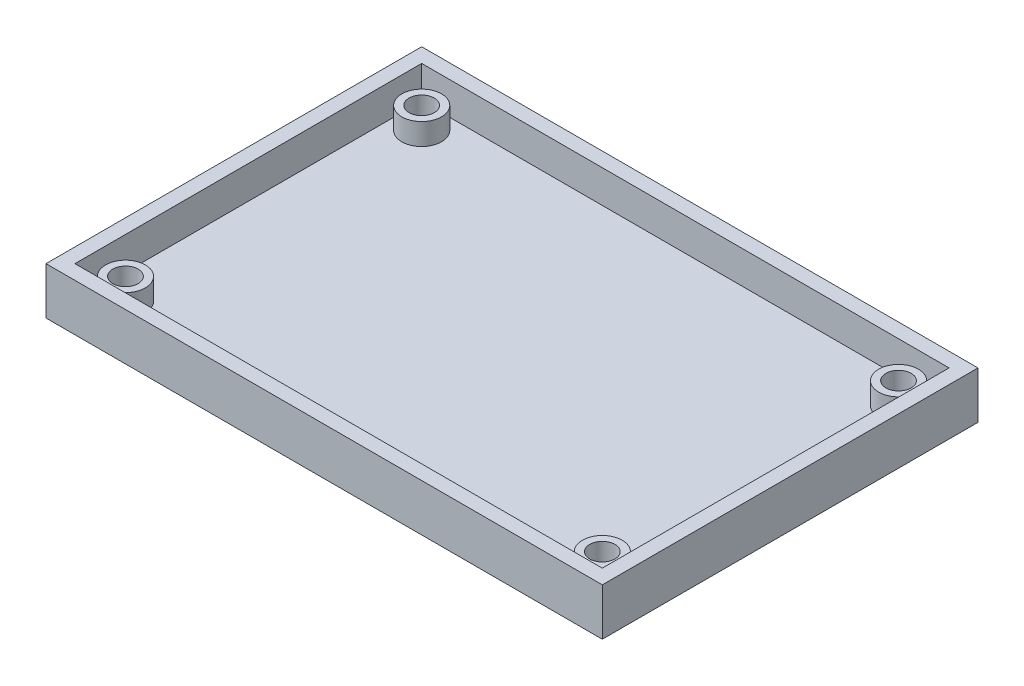
ISO-10303-21;
HEADER;
FILE_DESCRIPTION(('STEP AP214'),'2;1');
FILE_NAME('part.step','',(''),(''),'','','');
FILE_SCHEMA(('AUTOMOTIVE_DESIGN { 1 0 10303 214 1 1 1 1 }'));
ENDSEC;
DATA;
#1=APPLICATION_CONTEXT('core data for automotive mechanical design processes');
#2=APPLICATION_PROTOCOL_DEFINITION('international standard','automotive_design',2000,#1);
#3=PRODUCT_CONTEXT('',#1,'mechanical');
#4=PRODUCT('Part','Part','',(#3));
#5=PRODUCT_RELATED_PRODUCT_CATEGORY('part','',(#4));
#6=PRODUCT_DEFINITION_FORMATION('','',#4);
#7=PRODUCT_DEFINITION_CONTEXT('part definition',#1,'design');
#8=PRODUCT_DEFINITION('design','',#6,#7);
#9=PRODUCT_DEFINITION_SHAPE('','',#8);
#10=(LENGTH_UNIT() NAMED_UNIT(*) SI_UNIT(.MILLI.,.METRE.));
#11=(NAMED_UNIT(*) PLANE_ANGLE_UNIT() SI_UNIT($,.RADIAN.));
#12=(NAMED_UNIT(*) SI_UNIT($,.STERADIAN.) SOLID_ANGLE_UNIT());
#13=UNCERTAINTY_MEASURE_WITH_UNIT(LENGTH_MEASURE(1.E-05),#10,'distance_accuracy_value','');
#14=(GEOMETRIC_REPRESENTATION_CONTEXT(3) GLOBAL_UNCERTAINTY_ASSIGNED_CONTEXT((#13)) GLOBAL_UNIT_ASSIGNED_CONTEXT((#10,
#11,#12)) REPRESENTATION_CONTEXT('',''));
#15=CARTESIAN_POINT('',(0.,0.,0.));
#16=DIRECTION('',(0.,0.,1.));
#17=DIRECTION('',(1.,0.,0.));
#18=AXIS2_PLACEMENT_3D('',#15,#16,#17);
#19=CARTESIAN_POINT('',(0.,0.,0.));
#20=DIRECTION('',(0.,1.,0.));
#21=DIRECTION('',(0.,0.,1.));
#22=AXIS2_PLACEMENT_3D('',#19,#20,#21);
#23=PLANE('',#22);
#24=CARTESIAN_POINT('',(33.,0.,-20.5));
#25=DIRECTION('',(0.,1.,0.));
#26=DIRECTION('',(0.,0.,1.));
#27=AXIS2_PLACEMENT_3D('',#24,#25,#26);
#28=CIRCLE('',#27,2.75);
#29=CARTESIAN_POINT('',(33.,0.,-17.75));
#30=VERTEX_POINT('',#29);
#31=EDGE_CURVE('E276',#30,#30,#28,.T.);
#32=ORIENTED_EDGE('',*,*,#31,.F.);
#33=EDGE_LOOP('',(#32));
#34=FACE_BOUND('',#33,.T.);
#35=CARTESIAN_POINT('',(-33.,0.,20.5));
#36=DIRECTION('',(0.,1.,0.));
#37=DIRECTION('',(0.,0.,1.));
#38=AXIS2_PLACEMENT_3D('',#35,#36,#37);
#39=CIRCLE('',#38,2.75);
#40=CARTESIAN_POINT('',(-33.,0.,23.25));
#41=VERTEX_POINT('',#40);
#42=EDGE_CURVE('E294',#41,#41,#39,.T.);
#43=ORIENTED_EDGE('',*,*,#42,.F.);
#44=EDGE_LOOP('',(#43));
#45=FACE_BOUND('',#44,.T.);
#46=DIRECTION('',(1.,0.,0.));
#47=VECTOR('',#46,1.);
#48=CARTESIAN_POINT('',(-36.5,0.,24.));
#49=LINE('',#48,#47);
#50=CARTESIAN_POINT('',(-36.5,0.,24.));
#51=VERTEX_POINT('',#50);
#52=CARTESIAN_POINT('',(36.5,0.,24.));
#53=VERTEX_POINT('',#52);
#54=EDGE_CURVE('E135',#51,#53,#49,.T.);
#55=ORIENTED_EDGE('',*,*,#54,.T.);
#56=DIRECTION('',(0.,0.,-1.));
#57=VECTOR('',#56,1.);
#58=CARTESIAN_POINT('',(36.5,0.,-24.));
#59=LINE('',#58,#57);
#60=CARTESIAN_POINT('',(36.5,0.,-24.));
#61=VERTEX_POINT('',#60);
#62=EDGE_CURVE('E131',#53,#61,#59,.T.);
#63=ORIENTED_EDGE('',*,*,#62,.T.);
#64=DIRECTION('',(-1.,0.,0.));
#65=VECTOR('',#64,1.);
#66=CARTESIAN_POINT('',(-36.5,0.,-24.));
#67=LINE('',#66,#65);
#68=CARTESIAN_POINT('',(-36.5,0.,-24.));
#69=VERTEX_POINT('',#68);
#70=EDGE_CURVE('E144',#61,#69,#67,.T.);
#71=ORIENTED_EDGE('',*,*,#70,.T.);
#72=DIRECTION('',(0.,0.,1.));
#73=VECTOR('',#72,1.);
#74=CARTESIAN_POINT('',(-36.5,0.,-24.));
#75=LINE('',#74,#73);
#76=EDGE_CURVE('E147',#69,#51,#75,.T.);
#77=ORIENTED_EDGE('',*,*,#76,.T.);
#78=EDGE_LOOP('',(#55,#63,#71,#77));
#79=FACE_BOUND('',#78,.T.);
#80=CARTESIAN_POINT('',(33.,0.,20.5));
#81=DIRECTION('',(0.,1.,0.));
#82=DIRECTION('',(0.,0.,1.));
#83=AXIS2_PLACEMENT_3D('',#80,#81,#82);
#84=CIRCLE('',#83,2.75);
#85=CARTESIAN_POINT('',(33.,0.,23.25));
#86=VERTEX_POINT('',#85);
#87=EDGE_CURVE('E285',#86,#86,#84,.T.);
#88=ORIENTED_EDGE('',*,*,#87,.F.);
#89=EDGE_LOOP('',(#88));
#90=FACE_BOUND('',#89,.T.);
#91=CARTESIAN_POINT('',(-33.,0.,-20.5));
#92=DIRECTION('',(0.,1.,0.));
#93=DIRECTION('',(0.,0.,1.));
#94=AXIS2_PLACEMENT_3D('',#91,#92,#93);
#95=CIRCLE('',#94,2.75000000000001);
#96=CARTESIAN_POINT('',(-33.,0.,-17.75));
#97=VERTEX_POINT('',#96);
#98=EDGE_CURVE('E267',#97,#97,#95,.T.);
#99=ORIENTED_EDGE('',*,*,#98,.F.);
#100=EDGE_LOOP('',(#99));
#101=FACE_BOUND('',#100,.T.);
#102=ADVANCED_FACE('F35',(#34,#45,#79,#90,#101),#23,.T.);
#103=CARTESIAN_POINT('',(0.,4.524,0.));
#104=DIRECTION('',(0.,1.,0.));
#105=DIRECTION('',(0.,0.,1.));
#106=AXIS2_PLACEMENT_3D('',#103,#104,#105);
#107=PLANE('',#106);
#108=DIRECTION('',(0.,0.,-1.));
#109=VECTOR('',#108,1.);
#110=CARTESIAN_POINT('',(38.5,4.524,-26.));
#111=LINE('',#110,#109);
#112=CARTESIAN_POINT('',(38.5,4.524,26.));
#113=VERTEX_POINT('',#112);
#114=CARTESIAN_POINT('',(38.5,4.524,-26.));
#115=VERTEX_POINT('',#114);
#116=EDGE_CURVE('E159',#113,#115,#111,.T.);
#117=ORIENTED_EDGE('',*,*,#116,.T.);
#118=DIRECTION('',(-1.,0.,0.));
#119=VECTOR('',#118,1.);
#120=CARTESIAN_POINT('',(-38.5,4.524,-26.));
#121=LINE('',#120,#119);
#122=CARTESIAN_POINT('',(-38.5,4.524,-26.));
#123=VERTEX_POINT('',#122);
#124=EDGE_CURVE('E161',#115,#123,#121,.T.);
#125=ORIENTED_EDGE('',*,*,#124,.T.);
#126=DIRECTION('',(0.,0.,1.));
#127=VECTOR('',#126,1.);
#128=CARTESIAN_POINT('',(-38.5,4.524,-26.));
#129=LINE('',#128,#127);
#130=CARTESIAN_POINT('',(-38.5,4.524,26.));
#131=VERTEX_POINT('',#130);
#132=EDGE_CURVE('E106',#123,#131,#129,.T.);
#133=ORIENTED_EDGE('',*,*,#132,.T.);
#134=DIRECTION('',(1.,0.,0.));
#135=VECTOR('',#134,1.);
#136=CARTESIAN_POINT('',(-38.5,4.524,26.));
#137=LINE('',#136,#135);
#138=EDGE_CURVE('E58',#131,#113,#137,.T.);
#139=ORIENTED_EDGE('',*,*,#138,.T.);
#140=EDGE_LOOP('',(#117,#125,#133,#139));
#141=FACE_BOUND('',#140,.T.);
#142=DIRECTION('',(-1.,0.,0.));
#143=VECTOR('',#142,1.);
#144=CARTESIAN_POINT('',(-36.5,4.524,-24.));
#145=LINE('',#144,#143);
#146=CARTESIAN_POINT('',(36.5,4.524,-24.));
#147=VERTEX_POINT('',#146);
#148=CARTESIAN_POINT('',(-36.5,4.524,-24.));
#149=VERTEX_POINT('',#148);
#150=EDGE_CURVE('E134',#147,#149,#145,.T.);
#151=ORIENTED_EDGE('',*,*,#150,.F.);
#152=DIRECTION('',(0.,0.,-1.));
#153=VECTOR('',#152,1.);
#154=CARTESIAN_POINT('',(36.5,4.524,-24.));
#155=LINE('',#154,#153);
#156=CARTESIAN_POINT('',(36.5,4.524,24.));
#157=VERTEX_POINT('',#156);
#158=EDGE_CURVE('E132',#157,#147,#155,.T.);
#159=ORIENTED_EDGE('',*,*,#158,.F.);
#160=DIRECTION('',(1.,0.,0.));
#161=VECTOR('',#160,1.);
#162=CARTESIAN_POINT('',(-36.5,4.524,24.));
#163=LINE('',#162,#161);
#164=CARTESIAN_POINT('',(-36.5,4.524,24.));
#165=VERTEX_POINT('',#164);
#166=EDGE_CURVE('E139',#165,#157,#163,.T.);
#167=ORIENTED_EDGE('',*,*,#166,.F.);
#168=DIRECTION('',(0.,0.,1.));
#169=VECTOR('',#168,1.);
#170=CARTESIAN_POINT('',(-36.5,4.524,-24.));
#171=LINE('',#170,#169);
#172=EDGE_CURVE('E137',#149,#165,#171,.T.);
#173=ORIENTED_EDGE('',*,*,#172,.F.);
#174=EDGE_LOOP('',(#151,#159,#167,#173));
#175=FACE_BOUND('',#174,.T.);
#176=ADVANCED_FACE('F171',(#141,#175),#107,.T.);
#177=CARTESIAN_POINT('',(38.5,4.524,-26.));
#178=DIRECTION('',(-1.,0.,0.));
#179=DIRECTION('',(0.,0.,1.));
#180=AXIS2_PLACEMENT_3D('',#177,#178,#179);
#181=PLANE('',#180);
#182=DIRECTION('',(0.,-1.,0.));
#183=VECTOR('',#182,1.);
#184=CARTESIAN_POINT('',(38.5,4.524,26.));
#185=LINE('',#184,#183);
#186=CARTESIAN_POINT('',(38.5,-2.,26.));
#187=VERTEX_POINT('',#186);
#188=EDGE_CURVE('E165',#113,#187,#185,.T.);
#189=ORIENTED_EDGE('',*,*,#188,.T.);
#190=DIRECTION('',(0.,0.,1.));
#191=VECTOR('',#190,1.);
#192=CARTESIAN_POINT('',(38.5,-2.,26.));
#193=LINE('',#192,#191);
#194=CARTESIAN_POINT('',(38.5,-2.,-26.));
#195=VERTEX_POINT('',#194);
#196=EDGE_CURVE('E116',#195,#187,#193,.T.);
#197=ORIENTED_EDGE('',*,*,#196,.F.);
#198=DIRECTION('',(0.,-1.,0.));
#199=VECTOR('',#198,1.);
#200=CARTESIAN_POINT('',(38.5,4.524,-26.));
#201=LINE('',#200,#199);
#202=EDGE_CURVE('E11',#115,#195,#201,.T.);
#203=ORIENTED_EDGE('',*,*,#202,.F.);
#204=ORIENTED_EDGE('',*,*,#116,.F.);
#205=EDGE_LOOP('',(#189,#197,#203,#204));
#206=FACE_BOUND('',#205,.T.);
#207=ADVANCED_FACE('F37',(#206),#181,.F.);
#208=CARTESIAN_POINT('',(-38.5,4.524,-26.));
#209=DIRECTION('',(0.,0.,1.));
#210=DIRECTION('',(1.,0.,0.));
#211=AXIS2_PLACEMENT_3D('',#208,#209,#210);
#212=PLANE('',#211);
#213=ORIENTED_EDGE('',*,*,#202,.T.);
#214=DIRECTION('',(1.,0.,0.));
#215=VECTOR('',#214,1.);
#216=CARTESIAN_POINT('',(38.5,-2.,-26.));
#217=LINE('',#216,#215);
#218=CARTESIAN_POINT('',(-38.5,-2.,-26.));
#219=VERTEX_POINT('',#218);
#220=EDGE_CURVE('E110',#219,#195,#217,.T.);
#221=ORIENTED_EDGE('',*,*,#220,.F.);
#222=DIRECTION('',(0.,-1.,0.));
#223=VECTOR('',#222,1.);
#224=CARTESIAN_POINT('',(-38.5,4.524,-26.));
#225=LINE('',#224,#223);
#226=EDGE_CURVE('E43',#123,#219,#225,.T.);
#227=ORIENTED_EDGE('',*,*,#226,.F.);
#228=ORIENTED_EDGE('',*,*,#124,.F.);
#229=EDGE_LOOP('',(#213,#221,#227,#228));
#230=FACE_BOUND('',#229,.T.);
#231=ADVANCED_FACE('F111',(#230),#212,.F.);
#232=CARTESIAN_POINT('',(-38.5,4.524,-26.));
#233=DIRECTION('',(1.,0.,0.));
#234=DIRECTION('',(0.,0.,-1.));
#235=AXIS2_PLACEMENT_3D('',#232,#233,#234);
#236=PLANE('',#235);
#237=ORIENTED_EDGE('',*,*,#226,.T.);
#238=DIRECTION('',(0.,0.,-1.));
#239=VECTOR('',#238,1.);
#240=CARTESIAN_POINT('',(-38.5,-2.,26.));
#241=LINE('',#240,#239);
#242=CARTESIAN_POINT('',(-38.5,-2.,26.));
#243=VERTEX_POINT('',#242);
#244=EDGE_CURVE('E105',#243,#219,#241,.T.);
#245=ORIENTED_EDGE('',*,*,#244,.F.);
#246=DIRECTION('',(0.,-1.,0.));
#247=VECTOR('',#246,1.);
#248=CARTESIAN_POINT('',(-38.5,4.524,26.));
#249=LINE('',#248,#247);
#250=EDGE_CURVE('E108',#131,#243,#249,.T.);
#251=ORIENTED_EDGE('',*,*,#250,.F.);
#252=ORIENTED_EDGE('',*,*,#132,.F.);
#253=EDGE_LOOP('',(#237,#245,#251,#252));
#254=FACE_BOUND('',#253,.T.);
#255=ADVANCED_FACE('F102',(#254),#236,.F.);
#256=CARTESIAN_POINT('',(-38.5,4.524,26.));
#257=DIRECTION('',(0.,0.,-1.));
#258=DIRECTION('',(-1.,0.,0.));
#259=AXIS2_PLACEMENT_3D('',#256,#257,#258);
#260=PLANE('',#259);
#261=ORIENTED_EDGE('',*,*,#250,.T.);
#262=DIRECTION('',(-1.,0.,0.));
#263=VECTOR('',#262,1.);
#264=CARTESIAN_POINT('',(38.5,-2.,26.));
#265=LINE('',#264,#263);
#266=EDGE_CURVE('E121',#187,#243,#265,.T.);
#267=ORIENTED_EDGE('',*,*,#266,.F.);
#268=ORIENTED_EDGE('',*,*,#188,.F.);
#269=ORIENTED_EDGE('',*,*,#138,.F.);
#270=EDGE_LOOP('',(#261,#267,#268,#269));
#271=FACE_BOUND('',#270,.T.);
#272=ADVANCED_FACE('F168',(#271),#260,.F.);
#273=CARTESIAN_POINT('',(36.5,4.524,-24.));
#274=DIRECTION('',(-1.,0.,0.));
#275=DIRECTION('',(0.,0.,1.));
#276=AXIS2_PLACEMENT_3D('',#273,#274,#275);
#277=PLANE('',#276);
#278=ORIENTED_EDGE('',*,*,#62,.F.);
#279=DIRECTION('',(0.,-1.,0.));
#280=VECTOR('',#279,1.);
#281=CARTESIAN_POINT('',(36.5,4.524,24.));
#282=LINE('',#281,#280);
#283=EDGE_CURVE('E141',#157,#53,#282,.T.);
#284=ORIENTED_EDGE('',*,*,#283,.F.);
#285=ORIENTED_EDGE('',*,*,#158,.T.);
#286=DIRECTION('',(0.,-1.,0.));
#287=VECTOR('',#286,1.);
#288=CARTESIAN_POINT('',(36.5,4.524,-24.));
#289=LINE('',#288,#287);
#290=EDGE_CURVE('E156',#147,#61,#289,.T.);
#291=ORIENTED_EDGE('',*,*,#290,.T.);
#292=EDGE_LOOP('',(#278,#284,#285,#291));
#293=FACE_BOUND('',#292,.T.);
#294=ADVANCED_FACE('F190',(#293),#277,.T.);
#295=CARTESIAN_POINT('',(-36.5,4.524,-24.));
#296=DIRECTION('',(0.,0.,1.));
#297=DIRECTION('',(1.,0.,0.));
#298=AXIS2_PLACEMENT_3D('',#295,#296,#297);
#299=PLANE('',#298);
#300=ORIENTED_EDGE('',*,*,#70,.F.);
#301=ORIENTED_EDGE('',*,*,#290,.F.);
#302=ORIENTED_EDGE('',*,*,#150,.T.);
#303=DIRECTION('',(0.,-1.,0.));
#304=VECTOR('',#303,1.);
#305=CARTESIAN_POINT('',(-36.5,4.524,-24.));
#306=LINE('',#305,#304);
#307=EDGE_CURVE('E154',#149,#69,#306,.T.);
#308=ORIENTED_EDGE('',*,*,#307,.T.);
#309=EDGE_LOOP('',(#300,#301,#302,#308));
#310=FACE_BOUND('',#309,.T.);
#311=ADVANCED_FACE('F182',(#310),#299,.T.);
#312=CARTESIAN_POINT('',(-36.5,4.524,-24.));
#313=DIRECTION('',(1.,0.,0.));
#314=DIRECTION('',(0.,0.,-1.));
#315=AXIS2_PLACEMENT_3D('',#312,#313,#314);
#316=PLANE('',#315);
#317=ORIENTED_EDGE('',*,*,#76,.F.);
#318=ORIENTED_EDGE('',*,*,#307,.F.);
#319=ORIENTED_EDGE('',*,*,#172,.T.);
#320=DIRECTION('',(0.,-1.,0.));
#321=VECTOR('',#320,1.);
#322=CARTESIAN_POINT('',(-36.5,4.524,24.));
#323=LINE('',#322,#321);
#324=EDGE_CURVE('E50',#165,#51,#323,.T.);
#325=ORIENTED_EDGE('',*,*,#324,.T.);
#326=EDGE_LOOP('',(#317,#318,#319,#325));
#327=FACE_BOUND('',#326,.T.);
#328=ADVANCED_FACE('F185',(#327),#316,.T.);
#329=CARTESIAN_POINT('',(-36.5,4.524,24.));
#330=DIRECTION('',(0.,0.,-1.));
#331=DIRECTION('',(-1.,0.,0.));
#332=AXIS2_PLACEMENT_3D('',#329,#330,#331);
#333=PLANE('',#332);
#334=ORIENTED_EDGE('',*,*,#54,.F.);
#335=ORIENTED_EDGE('',*,*,#324,.F.);
#336=ORIENTED_EDGE('',*,*,#166,.T.);
#337=ORIENTED_EDGE('',*,*,#283,.T.);
#338=EDGE_LOOP('',(#334,#335,#336,#337));
#339=FACE_BOUND('',#338,.T.);
#340=ADVANCED_FACE('F192',(#339),#333,.T.);
#341=CARTESIAN_POINT('',(0.,-2.,0.));
#342=DIRECTION('',(0.,1.,0.));
#343=DIRECTION('',(0.,0.,1.));
#344=AXIS2_PLACEMENT_3D('',#341,#342,#343);
#345=PLANE('',#344);
#346=CARTESIAN_POINT('',(33.,-2.,-20.5));
#347=DIRECTION('',(0.,1.,0.));
#348=DIRECTION('',(0.,0.,1.));
#349=AXIS2_PLACEMENT_3D('',#346,#347,#348);
#350=CIRCLE('',#349,1.75);
#351=CARTESIAN_POINT('',(33.,-2.,-18.75));
#352=VERTEX_POINT('',#351);
#353=EDGE_CURVE('E125',#352,#352,#350,.T.);
#354=ORIENTED_EDGE('',*,*,#353,.T.);
#355=EDGE_LOOP('',(#354));
#356=FACE_BOUND('',#355,.T.);
#357=CARTESIAN_POINT('',(33.,-2.,20.5));
#358=DIRECTION('',(0.,1.,0.));
#359=DIRECTION('',(0.,0.,1.));
#360=AXIS2_PLACEMENT_3D('',#357,#358,#359);
#361=CIRCLE('',#360,1.75);
#362=CARTESIAN_POINT('',(33.,-2.,22.25));
#363=VERTEX_POINT('',#362);
#364=EDGE_CURVE('E303',#363,#363,#361,.T.);
#365=ORIENTED_EDGE('',*,*,#364,.T.);
#366=EDGE_LOOP('',(#365));
#367=FACE_BOUND('',#366,.T.);
#368=CARTESIAN_POINT('',(-33.,-2.,20.5));
#369=DIRECTION('',(0.,1.,0.));
#370=DIRECTION('',(0.,0.,1.));
#371=AXIS2_PLACEMENT_3D('',#368,#369,#370);
#372=CIRCLE('',#371,1.75);
#373=CARTESIAN_POINT('',(-33.,-2.,22.25));
#374=VERTEX_POINT('',#373);
#375=EDGE_CURVE('E298',#374,#374,#372,.T.);
#376=ORIENTED_EDGE('',*,*,#375,.T.);
#377=EDGE_LOOP('',(#376));
#378=FACE_BOUND('',#377,.T.);
#379=CARTESIAN_POINT('',(-33.,-2.,-20.5));
#380=DIRECTION('',(0.,1.,0.));
#381=DIRECTION('',(0.,0.,1.));
#382=AXIS2_PLACEMENT_3D('',#379,#380,#381);
#383=CIRCLE('',#382,1.75);
#384=CARTESIAN_POINT('',(-33.,-2.,-18.75));
#385=VERTEX_POINT('',#384);
#386=EDGE_CURVE('E122',#385,#385,#383,.T.);
#387=ORIENTED_EDGE('',*,*,#386,.T.);
#388=EDGE_LOOP('',(#387));
#389=FACE_BOUND('',#388,.T.);
#390=ORIENTED_EDGE('',*,*,#244,.T.);
#391=ORIENTED_EDGE('',*,*,#220,.T.);
#392=ORIENTED_EDGE('',*,*,#196,.T.);
#393=ORIENTED_EDGE('',*,*,#266,.T.);
#394=EDGE_LOOP('',(#390,#391,#392,#393));
#395=FACE_BOUND('',#394,.T.);
#396=ADVANCED_FACE('F119',(#356,#367,#378,#389,#395),#345,.F.);
#397=CARTESIAN_POINT('',(-33.,-2.,-20.5));
#398=DIRECTION('',(0.,1.,0.));
#399=DIRECTION('',(0.,0.,1.));
#400=AXIS2_PLACEMENT_3D('',#397,#398,#399);
#401=CYLINDRICAL_SURFACE('',#400,1.75);
#402=ORIENTED_EDGE('',*,*,#386,.F.);
#403=EDGE_LOOP('',(#402));
#404=FACE_BOUND('',#403,.T.);
#405=CARTESIAN_POINT('',(-33.,3.,-20.5));
#406=DIRECTION('',(0.,1.,0.));
#407=DIRECTION('',(0.,0.,1.));
#408=AXIS2_PLACEMENT_3D('',#405,#406,#407);
#409=CIRCLE('',#408,1.75000000000001);
#410=CARTESIAN_POINT('',(-33.,3.,-18.75));
#411=VERTEX_POINT('',#410);
#412=EDGE_CURVE('E265',#411,#411,#409,.T.);
#413=ORIENTED_EDGE('',*,*,#412,.T.);
#414=EDGE_LOOP('',(#413));
#415=FACE_BOUND('',#414,.T.);
#416=ADVANCED_FACE('F199',(#404,#415),#401,.F.);
#417=CARTESIAN_POINT('',(-33.,-2.,20.5));
#418=DIRECTION('',(0.,1.,0.));
#419=DIRECTION('',(0.,0.,1.));
#420=AXIS2_PLACEMENT_3D('',#417,#418,#419);
#421=CYLINDRICAL_SURFACE('',#420,1.75);
#422=ORIENTED_EDGE('',*,*,#375,.F.);
#423=EDGE_LOOP('',(#422));
#424=FACE_BOUND('',#423,.T.);
#425=CARTESIAN_POINT('',(-33.,3.,20.5));
#426=DIRECTION('',(0.,1.,0.));
#427=DIRECTION('',(0.,0.,1.));
#428=AXIS2_PLACEMENT_3D('',#425,#426,#427);
#429=CIRCLE('',#428,1.75);
#430=CARTESIAN_POINT('',(-33.,3.,22.25));
#431=VERTEX_POINT('',#430);
#432=EDGE_CURVE('E289',#431,#431,#429,.T.);
#433=ORIENTED_EDGE('',*,*,#432,.T.);
#434=EDGE_LOOP('',(#433));
#435=FACE_BOUND('',#434,.T.);
#436=ADVANCED_FACE('F213',(#424,#435),#421,.F.);
#437=CARTESIAN_POINT('',(33.,-2.,20.5));
#438=DIRECTION('',(0.,1.,0.));
#439=DIRECTION('',(0.,0.,1.));
#440=AXIS2_PLACEMENT_3D('',#437,#438,#439);
#441=CYLINDRICAL_SURFACE('',#440,1.75);
#442=ORIENTED_EDGE('',*,*,#364,.F.);
#443=EDGE_LOOP('',(#442));
#444=FACE_BOUND('',#443,.T.);
#445=CARTESIAN_POINT('',(33.,3.,20.5));
#446=DIRECTION('',(0.,1.,0.));
#447=DIRECTION('',(0.,0.,1.));
#448=AXIS2_PLACEMENT_3D('',#445,#446,#447);
#449=CIRCLE('',#448,1.75);
#450=CARTESIAN_POINT('',(33.,3.,22.25));
#451=VERTEX_POINT('',#450);
#452=EDGE_CURVE('E280',#451,#451,#449,.T.);
#453=ORIENTED_EDGE('',*,*,#452,.T.);
#454=EDGE_LOOP('',(#453));
#455=FACE_BOUND('',#454,.T.);
#456=ADVANCED_FACE('F217',(#444,#455),#441,.F.);
#457=CARTESIAN_POINT('',(33.,-2.,-20.5));
#458=DIRECTION('',(0.,1.,0.));
#459=DIRECTION('',(0.,0.,1.));
#460=AXIS2_PLACEMENT_3D('',#457,#458,#459);
#461=CYLINDRICAL_SURFACE('',#460,1.75);
#462=ORIENTED_EDGE('',*,*,#353,.F.);
#463=EDGE_LOOP('',(#462));
#464=FACE_BOUND('',#463,.T.);
#465=CARTESIAN_POINT('',(33.,3.,-20.5));
#466=DIRECTION('',(0.,1.,0.));
#467=DIRECTION('',(0.,0.,1.));
#468=AXIS2_PLACEMENT_3D('',#465,#466,#467);
#469=CIRCLE('',#468,1.75);
#470=CARTESIAN_POINT('',(33.,3.,-18.75));
#471=VERTEX_POINT('',#470);
#472=EDGE_CURVE('E272',#471,#471,#469,.T.);
#473=ORIENTED_EDGE('',*,*,#472,.T.);
#474=EDGE_LOOP('',(#473));
#475=FACE_BOUND('',#474,.T.);
#476=ADVANCED_FACE('F221',(#464,#475),#461,.F.);
#477=CARTESIAN_POINT('',(-33.,3.,20.5));
#478=DIRECTION('',(0.,1.,0.));
#479=DIRECTION('',(0.,0.,1.));
#480=AXIS2_PLACEMENT_3D('',#477,#478,#479);
#481=PLANE('',#480);
#482=CARTESIAN_POINT('',(-33.,3.,20.5));
#483=DIRECTION('',(0.,1.,0.));
#484=DIRECTION('',(0.,0.,1.));
#485=AXIS2_PLACEMENT_3D('',#482,#483,#484);
#486=CIRCLE('',#485,2.75);
#487=CARTESIAN_POINT('',(-33.,3.,23.25));
#488=VERTEX_POINT('',#487);
#489=EDGE_CURVE('E295',#488,#488,#486,.T.);
#490=ORIENTED_EDGE('',*,*,#489,.T.);
#491=EDGE_LOOP('',(#490));
#492=FACE_BOUND('',#491,.T.);
#493=ORIENTED_EDGE('',*,*,#432,.F.);
#494=EDGE_LOOP('',(#493));
#495=FACE_BOUND('',#494,.T.);
#496=ADVANCED_FACE('F225',(#492,#495),#481,.T.);
#497=CARTESIAN_POINT('',(-33.,3.,20.5));
#498=DIRECTION('',(0.,-1.,0.));
#499=DIRECTION('',(0.,0.,-1.));
#500=AXIS2_PLACEMENT_3D('',#497,#498,#499);
#501=CYLINDRICAL_SURFACE('',#500,2.75);
#502=ORIENTED_EDGE('',*,*,#489,.F.);
#503=EDGE_LOOP('',(#502));
#504=FACE_BOUND('',#503,.T.);
#505=ORIENTED_EDGE('',*,*,#42,.T.);
#506=EDGE_LOOP('',(#505));
#507=FACE_BOUND('',#506,.T.);
#508=ADVANCED_FACE('F227',(#504,#507),#501,.T.);
#509=CARTESIAN_POINT('',(33.,3.,20.5));
#510=DIRECTION('',(0.,1.,0.));
#511=DIRECTION('',(0.,0.,1.));
#512=AXIS2_PLACEMENT_3D('',#509,#510,#511);
#513=PLANE('',#512);
#514=CARTESIAN_POINT('',(33.,3.,20.5));
#515=DIRECTION('',(0.,1.,0.));
#516=DIRECTION('',(0.,0.,1.));
#517=AXIS2_PLACEMENT_3D('',#514,#515,#516);
#518=CIRCLE('',#517,2.75);
#519=CARTESIAN_POINT('',(33.,3.,23.25));
#520=VERTEX_POINT('',#519);
#521=EDGE_CURVE('E286',#520,#520,#518,.T.);
#522=ORIENTED_EDGE('',*,*,#521,.T.);
#523=EDGE_LOOP('',(#522));
#524=FACE_BOUND('',#523,.T.);
#525=ORIENTED_EDGE('',*,*,#452,.F.);
#526=EDGE_LOOP('',(#525));
#527=FACE_BOUND('',#526,.T.);
#528=ADVANCED_FACE('F230',(#524,#527),#513,.T.);
#529=CARTESIAN_POINT('',(33.,3.,20.5));
#530=DIRECTION('',(0.,-1.,0.));
#531=DIRECTION('',(0.,0.,-1.));
#532=AXIS2_PLACEMENT_3D('',#529,#530,#531);
#533=CYLINDRICAL_SURFACE('',#532,2.75);
#534=ORIENTED_EDGE('',*,*,#521,.F.);
#535=EDGE_LOOP('',(#534));
#536=FACE_BOUND('',#535,.T.);
#537=ORIENTED_EDGE('',*,*,#87,.T.);
#538=EDGE_LOOP('',(#537));
#539=FACE_BOUND('',#538,.T.);
#540=ADVANCED_FACE('F235',(#536,#539),#533,.T.);
#541=CARTESIAN_POINT('',(33.,3.,-20.5));
#542=DIRECTION('',(0.,1.,0.));
#543=DIRECTION('',(0.,0.,1.));
#544=AXIS2_PLACEMENT_3D('',#541,#542,#543);
#545=PLANE('',#544);
#546=CARTESIAN_POINT('',(33.,3.,-20.5));
#547=DIRECTION('',(0.,1.,0.));
#548=DIRECTION('',(0.,0.,1.));
#549=AXIS2_PLACEMENT_3D('',#546,#547,#548);
#550=CIRCLE('',#549,2.75);
#551=CARTESIAN_POINT('',(33.,3.,-17.75));
#552=VERTEX_POINT('',#551);
#553=EDGE_CURVE('E277',#552,#552,#550,.T.);
#554=ORIENTED_EDGE('',*,*,#553,.T.);
#555=EDGE_LOOP('',(#554));
#556=FACE_BOUND('',#555,.T.);
#557=ORIENTED_EDGE('',*,*,#472,.F.);
#558=EDGE_LOOP('',(#557));
#559=FACE_BOUND('',#558,.T.);
#560=ADVANCED_FACE('F238',(#556,#559),#545,.T.);
#561=CARTESIAN_POINT('',(33.,3.,-20.5));
#562=DIRECTION('',(0.,-1.,0.));
#563=DIRECTION('',(0.,0.,-1.));
#564=AXIS2_PLACEMENT_3D('',#561,#562,#563);
#565=CYLINDRICAL_SURFACE('',#564,2.75);
#566=ORIENTED_EDGE('',*,*,#553,.F.);
#567=EDGE_LOOP('',(#566));
#568=FACE_BOUND('',#567,.T.);
#569=ORIENTED_EDGE('',*,*,#31,.T.);
#570=EDGE_LOOP('',(#569));
#571=FACE_BOUND('',#570,.T.);
#572=ADVANCED_FACE('F243',(#568,#571),#565,.T.);
#573=CARTESIAN_POINT('',(-33.,3.,-20.5));
#574=DIRECTION('',(0.,1.,0.));
#575=DIRECTION('',(0.,0.,1.));
#576=AXIS2_PLACEMENT_3D('',#573,#574,#575);
#577=PLANE('',#576);
#578=CARTESIAN_POINT('',(-33.,3.,-20.5));
#579=DIRECTION('',(0.,1.,0.));
#580=DIRECTION('',(0.,0.,1.));
#581=AXIS2_PLACEMENT_3D('',#578,#579,#580);
#582=CIRCLE('',#581,2.75000000000001);
#583=CARTESIAN_POINT('',(-33.,3.,-17.75));
#584=VERTEX_POINT('',#583);
#585=EDGE_CURVE('E262',#584,#584,#582,.T.);
#586=ORIENTED_EDGE('',*,*,#585,.T.);
#587=EDGE_LOOP('',(#586));
#588=FACE_BOUND('',#587,.T.);
#589=ORIENTED_EDGE('',*,*,#412,.F.);
#590=EDGE_LOOP('',(#589));
#591=FACE_BOUND('',#590,.T.);
#592=ADVANCED_FACE('F246',(#588,#591),#577,.T.);
#593=CARTESIAN_POINT('',(-33.,3.,-20.5));
#594=DIRECTION('',(0.,-1.,0.));
#595=DIRECTION('',(0.,0.,-1.));
#596=AXIS2_PLACEMENT_3D('',#593,#594,#595);
#597=CYLINDRICAL_SURFACE('',#596,2.75000000000001);
#598=ORIENTED_EDGE('',*,*,#585,.F.);
#599=EDGE_LOOP('',(#598));
#600=FACE_BOUND('',#599,.T.);
#601=ORIENTED_EDGE('',*,*,#98,.T.);
#602=EDGE_LOOP('',(#601));
#603=FACE_BOUND('',#602,.T.);
#604=ADVANCED_FACE('F251',(#600,#603),#597,.T.);
#605=CLOSED_SHELL('',(#102,#176,#207,#231,#255,#272,#294,#311,#328,#340,#396,#416,#436,#456,
#476,#496,#508,#528,#540,#560,#572,#592,#604));
#606=MANIFOLD_SOLID_BREP('B2',#605);
#607=ADVANCED_BREP_SHAPE_REPRESENTATION('',(#18,#606),#14);
#608=SHAPE_DEFINITION_REPRESENTATION(#9,#607);
ENDSEC;
END-ISO-10303-21;
